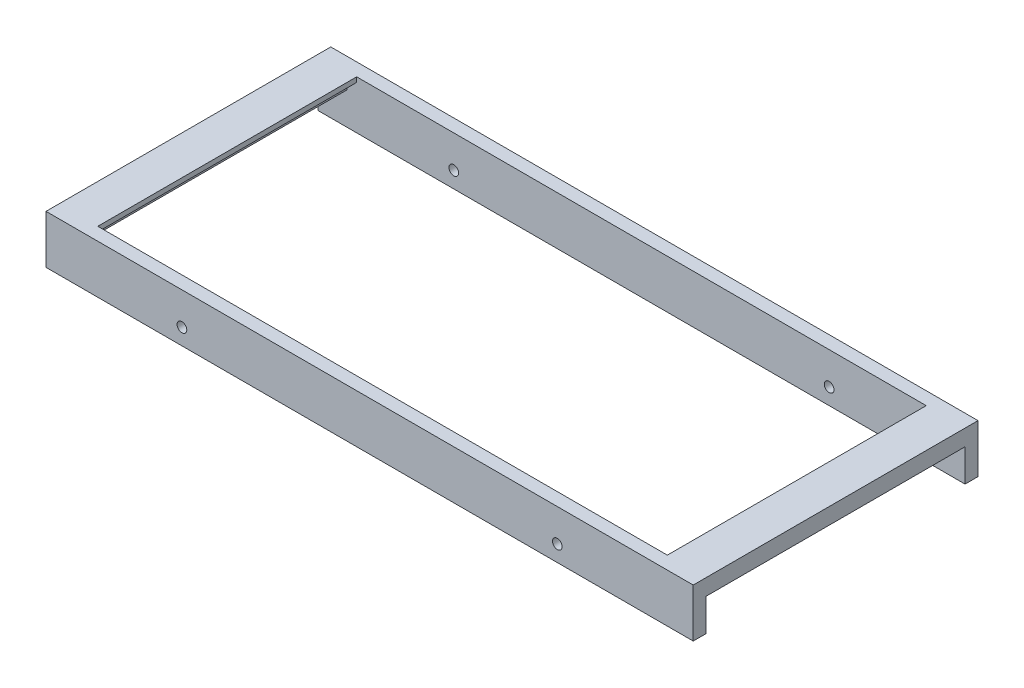
ISO-10303-21;
HEADER;
FILE_DESCRIPTION(('STEP AP214'),'2;1');
FILE_NAME('part.step','',(''),(''),'','','');
FILE_SCHEMA(('AUTOMOTIVE_DESIGN { 1 0 10303 214 1 1 1 1 }'));
ENDSEC;
DATA;
#1=APPLICATION_CONTEXT('core data for automotive mechanical design processes');
#2=APPLICATION_PROTOCOL_DEFINITION('international standard','automotive_design',2000,#1);
#3=PRODUCT_CONTEXT('',#1,'mechanical');
#4=PRODUCT('Part','Part','',(#3));
#5=PRODUCT_RELATED_PRODUCT_CATEGORY('part','',(#4));
#6=PRODUCT_DEFINITION_FORMATION('','',#4);
#7=PRODUCT_DEFINITION_CONTEXT('part definition',#1,'design');
#8=PRODUCT_DEFINITION('design','',#6,#7);
#9=PRODUCT_DEFINITION_SHAPE('','',#8);
#10=(LENGTH_UNIT() NAMED_UNIT(*) SI_UNIT(.MILLI.,.METRE.));
#11=(NAMED_UNIT(*) PLANE_ANGLE_UNIT() SI_UNIT($,.RADIAN.));
#12=(NAMED_UNIT(*) SI_UNIT($,.STERADIAN.) SOLID_ANGLE_UNIT());
#13=UNCERTAINTY_MEASURE_WITH_UNIT(LENGTH_MEASURE(1.E-05),#10,'distance_accuracy_value','');
#14=(GEOMETRIC_REPRESENTATION_CONTEXT(3) GLOBAL_UNCERTAINTY_ASSIGNED_CONTEXT((#13)) GLOBAL_UNIT_ASSIGNED_CONTEXT((#10,
#11,#12)) REPRESENTATION_CONTEXT('',''));
#15=CARTESIAN_POINT('',(0.,0.,0.));
#16=DIRECTION('',(0.,0.,1.));
#17=DIRECTION('',(1.,0.,0.));
#18=AXIS2_PLACEMENT_3D('',#15,#16,#17);
#19=CARTESIAN_POINT('',(191.,0.,4.));
#20=DIRECTION('',(-1.,0.,0.));
#21=DIRECTION('',(0.,0.,1.));
#22=AXIS2_PLACEMENT_3D('',#19,#20,#21);
#23=PLANE('',#22);
#24=DIRECTION('',(0.,0.,1.));
#25=VECTOR('',#24,1.);
#26=CARTESIAN_POINT('',(191.,32.,-80.));
#27=LINE('',#26,#25);
#28=CARTESIAN_POINT('',(191.,32.,-80.));
#29=VERTEX_POINT('',#28);
#30=CARTESIAN_POINT('',(191.,32.,0.));
#31=VERTEX_POINT('',#30);
#32=EDGE_CURVE('E256',#29,#31,#27,.T.);
#33=ORIENTED_EDGE('',*,*,#32,.F.);
#34=DIRECTION('',(0.,1.,0.));
#35=VECTOR('',#34,1.);
#36=CARTESIAN_POINT('',(191.,0.,-80.));
#37=LINE('',#36,#35);
#38=CARTESIAN_POINT('',(191.,28.5,-80.));
#39=VERTEX_POINT('',#38);
#40=EDGE_CURVE('E221',#39,#29,#37,.T.);
#41=ORIENTED_EDGE('',*,*,#40,.F.);
#42=DIRECTION('',(0.,0.,1.));
#43=VECTOR('',#42,1.);
#44=CARTESIAN_POINT('',(191.,28.5,-80.));
#45=LINE('',#44,#43);
#46=CARTESIAN_POINT('',(191.,28.5,0.));
#47=VERTEX_POINT('',#46);
#48=EDGE_CURVE('E259',#39,#47,#45,.T.);
#49=ORIENTED_EDGE('',*,*,#48,.T.);
#50=DIRECTION('',(0.,1.,0.));
#51=VECTOR('',#50,1.);
#52=CARTESIAN_POINT('',(191.,0.,0.));
#53=LINE('',#52,#51);
#54=EDGE_CURVE('E217',#47,#31,#53,.T.);
#55=ORIENTED_EDGE('',*,*,#54,.T.);
#56=EDGE_LOOP('',(#33,#41,#49,#55));
#57=FACE_BOUND('',#56,.T.);
#58=ADVANCED_FACE('F39',(#57),#23,.T.);
#59=CARTESIAN_POINT('',(9.,0.,4.));
#60=DIRECTION('',(-1.,0.,0.));
#61=DIRECTION('',(0.,0.,1.));
#62=AXIS2_PLACEMENT_3D('',#59,#60,#61);
#63=PLANE('',#62);
#64=DIRECTION('',(0.,1.,0.));
#65=VECTOR('',#64,1.);
#66=CARTESIAN_POINT('',(9.,0.,-80.));
#67=LINE('',#66,#65);
#68=CARTESIAN_POINT('',(9.,28.5,-80.));
#69=VERTEX_POINT('',#68);
#70=CARTESIAN_POINT('',(9.,32.,-80.));
#71=VERTEX_POINT('',#70);
#72=EDGE_CURVE('E304',#69,#71,#67,.T.);
#73=ORIENTED_EDGE('',*,*,#72,.T.);
#74=DIRECTION('',(0.,0.,1.));
#75=VECTOR('',#74,1.);
#76=CARTESIAN_POINT('',(9.,32.,-80.));
#77=LINE('',#76,#75);
#78=CARTESIAN_POINT('',(9.,32.,0.));
#79=VERTEX_POINT('',#78);
#80=EDGE_CURVE('E285',#71,#79,#77,.T.);
#81=ORIENTED_EDGE('',*,*,#80,.T.);
#82=DIRECTION('',(0.,1.,0.));
#83=VECTOR('',#82,1.);
#84=CARTESIAN_POINT('',(9.,0.,0.));
#85=LINE('',#84,#83);
#86=CARTESIAN_POINT('',(9.,28.5,0.));
#87=VERTEX_POINT('',#86);
#88=EDGE_CURVE('E232',#87,#79,#85,.T.);
#89=ORIENTED_EDGE('',*,*,#88,.F.);
#90=DIRECTION('',(0.,0.,1.));
#91=VECTOR('',#90,1.);
#92=CARTESIAN_POINT('',(9.,28.5,-80.));
#93=LINE('',#92,#91);
#94=EDGE_CURVE('E275',#69,#87,#93,.T.);
#95=ORIENTED_EDGE('',*,*,#94,.F.);
#96=EDGE_LOOP('',(#73,#81,#89,#95));
#97=FACE_BOUND('',#96,.T.);
#98=ADVANCED_FACE('F339',(#97),#63,.F.);
#99=CARTESIAN_POINT('',(0.,0.,0.));
#100=DIRECTION('',(0.,0.,1.));
#101=DIRECTION('',(1.,0.,0.));
#102=AXIS2_PLACEMENT_3D('',#99,#100,#101);
#103=PLANE('',#102);
#104=CARTESIAN_POINT('',(158.,23.5,0.));
#105=DIRECTION('',(0.,0.,1.));
#106=DIRECTION('',(1.,0.,0.));
#107=AXIS2_PLACEMENT_3D('',#104,#105,#106);
#108=CIRCLE('',#107,1.5);
#109=CARTESIAN_POINT('',(159.5,23.5,0.));
#110=VERTEX_POINT('',#109);
#111=EDGE_CURVE('E192',#110,#110,#108,.T.);
#112=ORIENTED_EDGE('',*,*,#111,.T.);
#113=EDGE_LOOP('',(#112));
#114=FACE_BOUND('',#113,.T.);
#115=CARTESIAN_POINT('',(42.,23.5,0.));
#116=DIRECTION('',(0.,0.,1.));
#117=DIRECTION('',(1.,0.,0.));
#118=AXIS2_PLACEMENT_3D('',#115,#116,#117);
#119=CIRCLE('',#118,1.5);
#120=CARTESIAN_POINT('',(43.5,23.5,0.));
#121=VERTEX_POINT('',#120);
#122=EDGE_CURVE('E189',#121,#121,#119,.F.);
#123=ORIENTED_EDGE('',*,*,#122,.F.);
#124=EDGE_LOOP('',(#123));
#125=FACE_BOUND('',#124,.T.);
#126=DIRECTION('',(0.,1.,0.));
#127=VECTOR('',#126,1.);
#128=CARTESIAN_POINT('',(200.,0.,0.));
#129=LINE('',#128,#127);
#130=CARTESIAN_POINT('',(200.,18.5,0.));
#131=VERTEX_POINT('',#130);
#132=CARTESIAN_POINT('',(200.,28.5,0.));
#133=VERTEX_POINT('',#132);
#134=EDGE_CURVE('E185',#131,#133,#129,.T.);
#135=ORIENTED_EDGE('',*,*,#134,.F.);
#136=DIRECTION('',(-1.,0.,0.));
#137=VECTOR('',#136,1.);
#138=CARTESIAN_POINT('',(0.,18.5,0.));
#139=LINE('',#138,#137);
#140=CARTESIAN_POINT('',(0.,18.5,0.));
#141=VERTEX_POINT('',#140);
#142=EDGE_CURVE('E302',#131,#141,#139,.T.);
#143=ORIENTED_EDGE('',*,*,#142,.T.);
#144=DIRECTION('',(0.,1.,0.));
#145=VECTOR('',#144,1.);
#146=CARTESIAN_POINT('',(0.,0.,0.));
#147=LINE('',#146,#145);
#148=CARTESIAN_POINT('',(0.,28.5,0.));
#149=VERTEX_POINT('',#148);
#150=EDGE_CURVE('E166',#141,#149,#147,.T.);
#151=ORIENTED_EDGE('',*,*,#150,.T.);
#152=DIRECTION('',(1.,0.,0.));
#153=VECTOR('',#152,1.);
#154=CARTESIAN_POINT('',(0.,28.5,0.));
#155=LINE('',#154,#153);
#156=EDGE_CURVE('E265',#149,#87,#155,.T.);
#157=ORIENTED_EDGE('',*,*,#156,.T.);
#158=ORIENTED_EDGE('',*,*,#88,.T.);
#159=DIRECTION('',(1.,0.,0.));
#160=VECTOR('',#159,1.);
#161=CARTESIAN_POINT('',(0.,32.,0.));
#162=LINE('',#161,#160);
#163=CARTESIAN_POINT('',(12.,32.,0.));
#164=VERTEX_POINT('',#163);
#165=EDGE_CURVE('E270',#79,#164,#162,.T.);
#166=ORIENTED_EDGE('',*,*,#165,.T.);
#167=DIRECTION('',(0.,-1.,0.));
#168=VECTOR('',#167,1.);
#169=CARTESIAN_POINT('',(12.,0.,0.));
#170=LINE('',#169,#168);
#171=CARTESIAN_POINT('',(12.,33.5,0.));
#172=VERTEX_POINT('',#171);
#173=EDGE_CURVE('E278',#172,#164,#170,.T.);
#174=ORIENTED_EDGE('',*,*,#173,.F.);
#175=DIRECTION('',(1.,0.,0.));
#176=VECTOR('',#175,1.);
#177=CARTESIAN_POINT('',(0.,33.5,0.));
#178=LINE('',#177,#176);
#179=CARTESIAN_POINT('',(188.,33.5,0.));
#180=VERTEX_POINT('',#179);
#181=EDGE_CURVE('E229',#172,#180,#178,.T.);
#182=ORIENTED_EDGE('',*,*,#181,.T.);
#183=DIRECTION('',(0.,-1.,0.));
#184=VECTOR('',#183,1.);
#185=CARTESIAN_POINT('',(188.,0.,0.));
#186=LINE('',#185,#184);
#187=CARTESIAN_POINT('',(188.,32.,0.));
#188=VERTEX_POINT('',#187);
#189=EDGE_CURVE('E240',#180,#188,#186,.T.);
#190=ORIENTED_EDGE('',*,*,#189,.T.);
#191=DIRECTION('',(-1.,0.,0.));
#192=VECTOR('',#191,1.);
#193=CARTESIAN_POINT('',(0.,32.,0.));
#194=LINE('',#193,#192);
#195=EDGE_CURVE('E247',#31,#188,#194,.T.);
#196=ORIENTED_EDGE('',*,*,#195,.F.);
#197=ORIENTED_EDGE('',*,*,#54,.F.);
#198=DIRECTION('',(-1.,0.,0.));
#199=VECTOR('',#198,1.);
#200=CARTESIAN_POINT('',(0.,28.5,0.));
#201=LINE('',#200,#199);
#202=EDGE_CURVE('E235',#133,#47,#201,.T.);
#203=ORIENTED_EDGE('',*,*,#202,.F.);
#204=EDGE_LOOP('',(#135,#143,#151,#157,#158,#166,#174,#182,#190,#196,#197,#203));
#205=FACE_BOUND('',#204,.T.);
#206=ADVANCED_FACE('F344',(#114,#125,#205),#103,.F.);
#207=CARTESIAN_POINT('',(200.,0.,4.));
#208=DIRECTION('',(-1.,0.,0.));
#209=DIRECTION('',(0.,0.,1.));
#210=AXIS2_PLACEMENT_3D('',#207,#208,#209);
#211=PLANE('',#210);
#212=DIRECTION('',(0.,1.,0.));
#213=VECTOR('',#212,1.);
#214=CARTESIAN_POINT('',(200.,0.,4.));
#215=LINE('',#214,#213);
#216=CARTESIAN_POINT('',(200.,18.5,4.));
#217=VERTEX_POINT('',#216);
#218=CARTESIAN_POINT('',(200.,33.5,4.));
#219=VERTEX_POINT('',#218);
#220=EDGE_CURVE('E179',#217,#219,#215,.T.);
#221=ORIENTED_EDGE('',*,*,#220,.F.);
#222=DIRECTION('',(0.,0.,-1.));
#223=VECTOR('',#222,1.);
#224=CARTESIAN_POINT('',(200.,18.5,4.));
#225=LINE('',#224,#223);
#226=EDGE_CURVE('E54',#217,#131,#225,.T.);
#227=ORIENTED_EDGE('',*,*,#226,.T.);
#228=ORIENTED_EDGE('',*,*,#134,.T.);
#229=DIRECTION('',(0.,0.,1.));
#230=VECTOR('',#229,1.);
#231=CARTESIAN_POINT('',(200.,28.5,-80.));
#232=LINE('',#231,#230);
#233=CARTESIAN_POINT('',(200.,28.5,-80.));
#234=VERTEX_POINT('',#233);
#235=EDGE_CURVE('E262',#234,#133,#232,.T.);
#236=ORIENTED_EDGE('',*,*,#235,.F.);
#237=DIRECTION('',(0.,1.,0.));
#238=VECTOR('',#237,1.);
#239=CARTESIAN_POINT('',(200.,0.,-80.));
#240=LINE('',#239,#238);
#241=CARTESIAN_POINT('',(200.,18.5,-80.));
#242=VERTEX_POINT('',#241);
#243=EDGE_CURVE('E220',#242,#234,#240,.T.);
#244=ORIENTED_EDGE('',*,*,#243,.F.);
#245=CARTESIAN_POINT('',(200.,18.5,-84.));
#246=VERTEX_POINT('',#245);
#247=EDGE_CURVE('E167',#242,#246,#225,.T.);
#248=ORIENTED_EDGE('',*,*,#247,.T.);
#249=DIRECTION('',(0.,1.,0.));
#250=VECTOR('',#249,1.);
#251=CARTESIAN_POINT('',(200.,0.,-84.));
#252=LINE('',#251,#250);
#253=CARTESIAN_POINT('',(200.,33.5,-84.));
#254=VERTEX_POINT('',#253);
#255=EDGE_CURVE('E204',#246,#254,#252,.T.);
#256=ORIENTED_EDGE('',*,*,#255,.T.);
#257=DIRECTION('',(0.,0.,-1.));
#258=VECTOR('',#257,1.);
#259=CARTESIAN_POINT('',(200.,33.5,4.));
#260=LINE('',#259,#258);
#261=EDGE_CURVE('E11',#219,#254,#260,.T.);
#262=ORIENTED_EDGE('',*,*,#261,.F.);
#263=EDGE_LOOP('',(#221,#227,#228,#236,#244,#248,#256,#262));
#264=FACE_BOUND('',#263,.T.);
#265=ADVANCED_FACE('F41',(#264),#211,.F.);
#266=CARTESIAN_POINT('',(0.,33.5,4.));
#267=DIRECTION('',(0.,1.,0.));
#268=DIRECTION('',(-1.,0.,0.));
#269=AXIS2_PLACEMENT_3D('',#266,#267,#268);
#270=PLANE('',#269);
#271=DIRECTION('',(1.,0.,0.));
#272=VECTOR('',#271,1.);
#273=CARTESIAN_POINT('',(0.,33.5,-80.));
#274=LINE('',#273,#272);
#275=CARTESIAN_POINT('',(12.,33.5,-80.));
#276=VERTEX_POINT('',#275);
#277=CARTESIAN_POINT('',(188.,33.5,-80.));
#278=VERTEX_POINT('',#277);
#279=EDGE_CURVE('E307',#276,#278,#274,.T.);
#280=ORIENTED_EDGE('',*,*,#279,.T.);
#281=DIRECTION('',(0.,0.,1.));
#282=VECTOR('',#281,1.);
#283=CARTESIAN_POINT('',(188.,33.5,-80.));
#284=LINE('',#283,#282);
#285=EDGE_CURVE('E245',#278,#180,#284,.T.);
#286=ORIENTED_EDGE('',*,*,#285,.T.);
#287=ORIENTED_EDGE('',*,*,#181,.F.);
#288=DIRECTION('',(0.,0.,1.));
#289=VECTOR('',#288,1.);
#290=CARTESIAN_POINT('',(12.,33.5,-80.));
#291=LINE('',#290,#289);
#292=EDGE_CURVE('E289',#276,#172,#291,.T.);
#293=ORIENTED_EDGE('',*,*,#292,.F.);
#294=EDGE_LOOP('',(#280,#286,#287,#293));
#295=FACE_BOUND('',#294,.T.);
#296=DIRECTION('',(0.,0.,-1.));
#297=VECTOR('',#296,1.);
#298=CARTESIAN_POINT('',(0.,33.5,4.));
#299=LINE('',#298,#297);
#300=CARTESIAN_POINT('',(0.,33.5,4.));
#301=VERTEX_POINT('',#300);
#302=CARTESIAN_POINT('',(0.,33.5,-84.));
#303=VERTEX_POINT('',#302);
#304=EDGE_CURVE('E47',#301,#303,#299,.T.);
#305=ORIENTED_EDGE('',*,*,#304,.F.);
#306=DIRECTION('',(1.,0.,0.));
#307=VECTOR('',#306,1.);
#308=CARTESIAN_POINT('',(0.,33.5,4.));
#309=LINE('',#308,#307);
#310=EDGE_CURVE('E172',#301,#219,#309,.T.);
#311=ORIENTED_EDGE('',*,*,#310,.T.);
#312=ORIENTED_EDGE('',*,*,#261,.T.);
#313=DIRECTION('',(1.,0.,0.));
#314=VECTOR('',#313,1.);
#315=CARTESIAN_POINT('',(0.,33.5,-84.));
#316=LINE('',#315,#314);
#317=EDGE_CURVE('E199',#303,#254,#316,.T.);
#318=ORIENTED_EDGE('',*,*,#317,.F.);
#319=EDGE_LOOP('',(#305,#311,#312,#318));
#320=FACE_BOUND('',#319,.T.);
#321=ADVANCED_FACE('F200',(#295,#320),#270,.T.);
#322=CARTESIAN_POINT('',(42.,23.5,4.));
#323=DIRECTION('',(0.,0.,-1.));
#324=DIRECTION('',(-1.,0.,0.));
#325=AXIS2_PLACEMENT_3D('',#322,#323,#324);
#326=CYLINDRICAL_SURFACE('',#325,1.5);
#327=CARTESIAN_POINT('',(42.,23.5,4.));
#328=DIRECTION('',(0.,0.,1.));
#329=DIRECTION('',(1.,0.,0.));
#330=AXIS2_PLACEMENT_3D('',#327,#328,#329);
#331=CIRCLE('',#330,1.5);
#332=CARTESIAN_POINT('',(43.5,23.5,4.));
#333=VERTEX_POINT('',#332);
#334=EDGE_CURVE('E174',#333,#333,#331,.F.);
#335=ORIENTED_EDGE('',*,*,#334,.F.);
#336=EDGE_LOOP('',(#335));
#337=FACE_BOUND('',#336,.T.);
#338=ORIENTED_EDGE('',*,*,#122,.T.);
#339=EDGE_LOOP('',(#338));
#340=FACE_BOUND('',#339,.T.);
#341=ADVANCED_FACE('F369',(#337,#340),#326,.F.);
#342=CARTESIAN_POINT('',(0.,0.,4.));
#343=DIRECTION('',(-1.,0.,0.));
#344=DIRECTION('',(0.,0.,1.));
#345=AXIS2_PLACEMENT_3D('',#342,#343,#344);
#346=PLANE('',#345);
#347=DIRECTION('',(0.,0.,-1.));
#348=VECTOR('',#347,1.);
#349=CARTESIAN_POINT('',(0.,18.5,4.));
#350=LINE('',#349,#348);
#351=CARTESIAN_POINT('',(0.,18.5,4.));
#352=VERTEX_POINT('',#351);
#353=EDGE_CURVE('E152',#352,#141,#350,.T.);
#354=ORIENTED_EDGE('',*,*,#353,.F.);
#355=DIRECTION('',(0.,1.,0.));
#356=VECTOR('',#355,1.);
#357=CARTESIAN_POINT('',(0.,0.,4.));
#358=LINE('',#357,#356);
#359=EDGE_CURVE('E163',#352,#301,#358,.T.);
#360=ORIENTED_EDGE('',*,*,#359,.T.);
#361=ORIENTED_EDGE('',*,*,#304,.T.);
#362=DIRECTION('',(0.,1.,0.));
#363=VECTOR('',#362,1.);
#364=CARTESIAN_POINT('',(0.,0.,-84.));
#365=LINE('',#364,#363);
#366=CARTESIAN_POINT('',(0.,18.5,-84.));
#367=VERTEX_POINT('',#366);
#368=EDGE_CURVE('E196',#367,#303,#365,.T.);
#369=ORIENTED_EDGE('',*,*,#368,.F.);
#370=CARTESIAN_POINT('',(0.,18.5,-80.));
#371=VERTEX_POINT('',#370);
#372=EDGE_CURVE('E62',#371,#367,#350,.T.);
#373=ORIENTED_EDGE('',*,*,#372,.F.);
#374=DIRECTION('',(0.,1.,0.));
#375=VECTOR('',#374,1.);
#376=CARTESIAN_POINT('',(0.,0.,-80.));
#377=LINE('',#376,#375);
#378=CARTESIAN_POINT('',(0.,28.5,-80.));
#379=VERTEX_POINT('',#378);
#380=EDGE_CURVE('E218',#371,#379,#377,.T.);
#381=ORIENTED_EDGE('',*,*,#380,.T.);
#382=DIRECTION('',(0.,0.,1.));
#383=VECTOR('',#382,1.);
#384=CARTESIAN_POINT('',(0.,28.5,-80.));
#385=LINE('',#384,#383);
#386=EDGE_CURVE('E187',#379,#149,#385,.T.);
#387=ORIENTED_EDGE('',*,*,#386,.T.);
#388=ORIENTED_EDGE('',*,*,#150,.F.);
#389=EDGE_LOOP('',(#354,#360,#361,#369,#373,#381,#387,#388));
#390=FACE_BOUND('',#389,.T.);
#391=ADVANCED_FACE('F161',(#390),#346,.T.);
#392=CARTESIAN_POINT('',(158.,23.5,4.));
#393=DIRECTION('',(0.,0.,-1.));
#394=DIRECTION('',(-1.,0.,0.));
#395=AXIS2_PLACEMENT_3D('',#392,#393,#394);
#396=CYLINDRICAL_SURFACE('',#395,1.5);
#397=CARTESIAN_POINT('',(158.,23.5,4.));
#398=DIRECTION('',(0.,0.,1.));
#399=DIRECTION('',(1.,0.,0.));
#400=AXIS2_PLACEMENT_3D('',#397,#398,#399);
#401=CIRCLE('',#400,1.5);
#402=CARTESIAN_POINT('',(159.5,23.5,4.));
#403=VERTEX_POINT('',#402);
#404=EDGE_CURVE('E177',#403,#403,#401,.T.);
#405=ORIENTED_EDGE('',*,*,#404,.T.);
#406=EDGE_LOOP('',(#405));
#407=FACE_BOUND('',#406,.T.);
#408=ORIENTED_EDGE('',*,*,#111,.F.);
#409=EDGE_LOOP('',(#408));
#410=FACE_BOUND('',#409,.T.);
#411=ADVANCED_FACE('F372',(#407,#410),#396,.F.);
#412=CARTESIAN_POINT('',(0.,0.,4.));
#413=DIRECTION('',(0.,0.,1.));
#414=DIRECTION('',(1.,0.,0.));
#415=AXIS2_PLACEMENT_3D('',#412,#413,#414);
#416=PLANE('',#415);
#417=DIRECTION('',(1.,0.,0.));
#418=VECTOR('',#417,1.);
#419=CARTESIAN_POINT('',(0.,18.5,4.));
#420=LINE('',#419,#418);
#421=EDGE_CURVE('E149',#352,#217,#420,.T.);
#422=ORIENTED_EDGE('',*,*,#421,.T.);
#423=ORIENTED_EDGE('',*,*,#220,.T.);
#424=ORIENTED_EDGE('',*,*,#310,.F.);
#425=ORIENTED_EDGE('',*,*,#359,.F.);
#426=EDGE_LOOP('',(#422,#423,#424,#425));
#427=FACE_BOUND('',#426,.T.);
#428=ORIENTED_EDGE('',*,*,#334,.T.);
#429=EDGE_LOOP('',(#428));
#430=FACE_BOUND('',#429,.T.);
#431=ORIENTED_EDGE('',*,*,#404,.F.);
#432=EDGE_LOOP('',(#431));
#433=FACE_BOUND('',#432,.T.);
#434=ADVANCED_FACE('F169',(#427,#430,#433),#416,.T.);
#435=CARTESIAN_POINT('',(0.,28.5,-80.));
#436=DIRECTION('',(0.,-1.,0.));
#437=DIRECTION('',(0.,0.,-1.));
#438=AXIS2_PLACEMENT_3D('',#435,#436,#437);
#439=PLANE('',#438);
#440=ORIENTED_EDGE('',*,*,#156,.F.);
#441=ORIENTED_EDGE('',*,*,#386,.F.);
#442=DIRECTION('',(1.,0.,0.));
#443=VECTOR('',#442,1.);
#444=CARTESIAN_POINT('',(0.,28.5,-80.));
#445=LINE('',#444,#443);
#446=EDGE_CURVE('E266',#379,#69,#445,.T.);
#447=ORIENTED_EDGE('',*,*,#446,.T.);
#448=ORIENTED_EDGE('',*,*,#94,.T.);
#449=EDGE_LOOP('',(#440,#441,#447,#448));
#450=FACE_BOUND('',#449,.T.);
#451=ADVANCED_FACE('F347',(#450),#439,.T.);
#452=CARTESIAN_POINT('',(12.,0.,-80.));
#453=DIRECTION('',(-1.,0.,0.));
#454=DIRECTION('',(0.,0.,1.));
#455=AXIS2_PLACEMENT_3D('',#452,#453,#454);
#456=PLANE('',#455);
#457=ORIENTED_EDGE('',*,*,#173,.T.);
#458=DIRECTION('',(0.,0.,1.));
#459=VECTOR('',#458,1.);
#460=CARTESIAN_POINT('',(12.,32.,-80.));
#461=LINE('',#460,#459);
#462=CARTESIAN_POINT('',(12.,32.,-80.));
#463=VERTEX_POINT('',#462);
#464=EDGE_CURVE('E287',#463,#164,#461,.T.);
#465=ORIENTED_EDGE('',*,*,#464,.F.);
#466=DIRECTION('',(0.,-1.,0.));
#467=VECTOR('',#466,1.);
#468=CARTESIAN_POINT('',(12.,0.,-80.));
#469=LINE('',#468,#467);
#470=EDGE_CURVE('E269',#276,#463,#469,.T.);
#471=ORIENTED_EDGE('',*,*,#470,.F.);
#472=ORIENTED_EDGE('',*,*,#292,.T.);
#473=EDGE_LOOP('',(#457,#465,#471,#472));
#474=FACE_BOUND('',#473,.T.);
#475=ADVANCED_FACE('F333',(#474),#456,.F.);
#476=CARTESIAN_POINT('',(0.,32.,-80.));
#477=DIRECTION('',(0.,-1.,0.));
#478=DIRECTION('',(0.,0.,-1.));
#479=AXIS2_PLACEMENT_3D('',#476,#477,#478);
#480=PLANE('',#479);
#481=ORIENTED_EDGE('',*,*,#165,.F.);
#482=ORIENTED_EDGE('',*,*,#80,.F.);
#483=DIRECTION('',(1.,0.,0.));
#484=VECTOR('',#483,1.);
#485=CARTESIAN_POINT('',(0.,32.,-80.));
#486=LINE('',#485,#484);
#487=EDGE_CURVE('E272',#71,#463,#486,.T.);
#488=ORIENTED_EDGE('',*,*,#487,.T.);
#489=ORIENTED_EDGE('',*,*,#464,.T.);
#490=EDGE_LOOP('',(#481,#482,#488,#489));
#491=FACE_BOUND('',#490,.T.);
#492=ADVANCED_FACE('F341',(#491),#480,.T.);
#493=CARTESIAN_POINT('',(0.,28.5,-80.));
#494=DIRECTION('',(0.,1.,0.));
#495=DIRECTION('',(0.,0.,1.));
#496=AXIS2_PLACEMENT_3D('',#493,#494,#495);
#497=PLANE('',#496);
#498=ORIENTED_EDGE('',*,*,#202,.T.);
#499=ORIENTED_EDGE('',*,*,#48,.F.);
#500=DIRECTION('',(-1.,0.,0.));
#501=VECTOR('',#500,1.);
#502=CARTESIAN_POINT('',(0.,28.5,-80.));
#503=LINE('',#502,#501);
#504=EDGE_CURVE('E236',#234,#39,#503,.T.);
#505=ORIENTED_EDGE('',*,*,#504,.F.);
#506=ORIENTED_EDGE('',*,*,#235,.T.);
#507=EDGE_LOOP('',(#498,#499,#505,#506));
#508=FACE_BOUND('',#507,.T.);
#509=ADVANCED_FACE('F352',(#508),#497,.F.);
#510=CARTESIAN_POINT('',(0.,32.,-80.));
#511=DIRECTION('',(0.,1.,0.));
#512=DIRECTION('',(0.,0.,1.));
#513=AXIS2_PLACEMENT_3D('',#510,#511,#512);
#514=PLANE('',#513);
#515=ORIENTED_EDGE('',*,*,#195,.T.);
#516=DIRECTION('',(0.,0.,1.));
#517=VECTOR('',#516,1.);
#518=CARTESIAN_POINT('',(188.,32.,-80.));
#519=LINE('',#518,#517);
#520=CARTESIAN_POINT('',(188.,32.,-80.));
#521=VERTEX_POINT('',#520);
#522=EDGE_CURVE('E254',#521,#188,#519,.T.);
#523=ORIENTED_EDGE('',*,*,#522,.F.);
#524=DIRECTION('',(-1.,0.,0.));
#525=VECTOR('',#524,1.);
#526=CARTESIAN_POINT('',(0.,32.,-80.));
#527=LINE('',#526,#525);
#528=EDGE_CURVE('E239',#29,#521,#527,.T.);
#529=ORIENTED_EDGE('',*,*,#528,.F.);
#530=ORIENTED_EDGE('',*,*,#32,.T.);
#531=EDGE_LOOP('',(#515,#523,#529,#530));
#532=FACE_BOUND('',#531,.T.);
#533=ADVANCED_FACE('F322',(#532),#514,.F.);
#534=CARTESIAN_POINT('',(188.,0.,-80.));
#535=DIRECTION('',(-1.,0.,0.));
#536=DIRECTION('',(0.,0.,1.));
#537=AXIS2_PLACEMENT_3D('',#534,#535,#536);
#538=PLANE('',#537);
#539=ORIENTED_EDGE('',*,*,#189,.F.);
#540=ORIENTED_EDGE('',*,*,#285,.F.);
#541=DIRECTION('',(0.,-1.,0.));
#542=VECTOR('',#541,1.);
#543=CARTESIAN_POINT('',(188.,0.,-80.));
#544=LINE('',#543,#542);
#545=EDGE_CURVE('E242',#278,#521,#544,.T.);
#546=ORIENTED_EDGE('',*,*,#545,.T.);
#547=ORIENTED_EDGE('',*,*,#522,.T.);
#548=EDGE_LOOP('',(#539,#540,#546,#547));
#549=FACE_BOUND('',#548,.T.);
#550=ADVANCED_FACE('F325',(#549),#538,.T.);
#551=CARTESIAN_POINT('',(0.,0.,-80.));
#552=DIRECTION('',(0.,0.,-1.));
#553=DIRECTION('',(1.,0.,0.));
#554=AXIS2_PLACEMENT_3D('',#551,#552,#553);
#555=PLANE('',#554);
#556=ORIENTED_EDGE('',*,*,#380,.F.);
#557=DIRECTION('',(1.,0.,0.));
#558=VECTOR('',#557,1.);
#559=CARTESIAN_POINT('',(0.,18.5,-80.));
#560=LINE('',#559,#558);
#561=EDGE_CURVE('E298',#371,#242,#560,.T.);
#562=ORIENTED_EDGE('',*,*,#561,.T.);
#563=ORIENTED_EDGE('',*,*,#243,.T.);
#564=ORIENTED_EDGE('',*,*,#504,.T.);
#565=ORIENTED_EDGE('',*,*,#40,.T.);
#566=ORIENTED_EDGE('',*,*,#528,.T.);
#567=ORIENTED_EDGE('',*,*,#545,.F.);
#568=ORIENTED_EDGE('',*,*,#279,.F.);
#569=ORIENTED_EDGE('',*,*,#470,.T.);
#570=ORIENTED_EDGE('',*,*,#487,.F.);
#571=ORIENTED_EDGE('',*,*,#72,.F.);
#572=ORIENTED_EDGE('',*,*,#446,.F.);
#573=EDGE_LOOP('',(#556,#562,#563,#564,#565,#566,#567,#568,#569,#570,#571,#572));
#574=FACE_BOUND('',#573,.T.);
#575=CARTESIAN_POINT('',(42.,23.5,-80.));
#576=DIRECTION('',(0.,0.,1.));
#577=DIRECTION('',(1.,0.,0.));
#578=AXIS2_PLACEMENT_3D('',#575,#576,#577);
#579=CIRCLE('',#578,1.5);
#580=CARTESIAN_POINT('',(43.5,23.5,-80.));
#581=VERTEX_POINT('',#580);
#582=EDGE_CURVE('E223',#581,#581,#579,.F.);
#583=ORIENTED_EDGE('',*,*,#582,.T.);
#584=EDGE_LOOP('',(#583));
#585=FACE_BOUND('',#584,.T.);
#586=CARTESIAN_POINT('',(158.,23.5,-80.));
#587=DIRECTION('',(0.,0.,1.));
#588=DIRECTION('',(1.,0.,0.));
#589=AXIS2_PLACEMENT_3D('',#586,#587,#588);
#590=CIRCLE('',#589,1.5);
#591=CARTESIAN_POINT('',(159.5,23.5,-80.));
#592=VERTEX_POINT('',#591);
#593=EDGE_CURVE('E208',#592,#592,#590,.T.);
#594=ORIENTED_EDGE('',*,*,#593,.F.);
#595=EDGE_LOOP('',(#594));
#596=FACE_BOUND('',#595,.T.);
#597=ADVANCED_FACE('F312',(#574,#585,#596),#555,.F.);
#598=CARTESIAN_POINT('',(42.,23.5,-84.));
#599=DIRECTION('',(0.,0.,1.));
#600=DIRECTION('',(1.,0.,0.));
#601=AXIS2_PLACEMENT_3D('',#598,#599,#600);
#602=CYLINDRICAL_SURFACE('',#601,1.5);
#603=CARTESIAN_POINT('',(42.,23.5,-84.));
#604=DIRECTION('',(0.,0.,1.));
#605=DIRECTION('',(1.,0.,0.));
#606=AXIS2_PLACEMENT_3D('',#603,#604,#605);
#607=CIRCLE('',#606,1.5);
#608=CARTESIAN_POINT('',(43.5,23.5,-84.));
#609=VERTEX_POINT('',#608);
#610=EDGE_CURVE('E206',#609,#609,#607,.F.);
#611=ORIENTED_EDGE('',*,*,#610,.T.);
#612=EDGE_LOOP('',(#611));
#613=FACE_BOUND('',#612,.T.);
#614=ORIENTED_EDGE('',*,*,#582,.F.);
#615=EDGE_LOOP('',(#614));
#616=FACE_BOUND('',#615,.T.);
#617=ADVANCED_FACE('F424',(#613,#616),#602,.F.);
#618=CARTESIAN_POINT('',(158.,23.5,-84.));
#619=DIRECTION('',(0.,0.,1.));
#620=DIRECTION('',(1.,0.,0.));
#621=AXIS2_PLACEMENT_3D('',#618,#619,#620);
#622=CYLINDRICAL_SURFACE('',#621,1.5);
#623=CARTESIAN_POINT('',(158.,23.5,-84.));
#624=DIRECTION('',(0.,0.,1.));
#625=DIRECTION('',(1.,0.,0.));
#626=AXIS2_PLACEMENT_3D('',#623,#624,#625);
#627=CIRCLE('',#626,1.5);
#628=CARTESIAN_POINT('',(159.5,23.5,-84.));
#629=VERTEX_POINT('',#628);
#630=EDGE_CURVE('E214',#629,#629,#627,.T.);
#631=ORIENTED_EDGE('',*,*,#630,.F.);
#632=EDGE_LOOP('',(#631));
#633=FACE_BOUND('',#632,.T.);
#634=ORIENTED_EDGE('',*,*,#593,.T.);
#635=EDGE_LOOP('',(#634));
#636=FACE_BOUND('',#635,.T.);
#637=ADVANCED_FACE('F429',(#633,#636),#622,.F.);
#638=CARTESIAN_POINT('',(0.,0.,-84.));
#639=DIRECTION('',(0.,0.,-1.));
#640=DIRECTION('',(1.,0.,0.));
#641=AXIS2_PLACEMENT_3D('',#638,#639,#640);
#642=PLANE('',#641);
#643=DIRECTION('',(1.,0.,0.));
#644=VECTOR('',#643,1.);
#645=CARTESIAN_POINT('',(0.,18.5,-84.));
#646=LINE('',#645,#644);
#647=EDGE_CURVE('E157',#367,#246,#646,.T.);
#648=ORIENTED_EDGE('',*,*,#647,.F.);
#649=ORIENTED_EDGE('',*,*,#368,.T.);
#650=ORIENTED_EDGE('',*,*,#317,.T.);
#651=ORIENTED_EDGE('',*,*,#255,.F.);
#652=EDGE_LOOP('',(#648,#649,#650,#651));
#653=FACE_BOUND('',#652,.T.);
#654=ORIENTED_EDGE('',*,*,#610,.F.);
#655=EDGE_LOOP('',(#654));
#656=FACE_BOUND('',#655,.T.);
#657=ORIENTED_EDGE('',*,*,#630,.T.);
#658=EDGE_LOOP('',(#657));
#659=FACE_BOUND('',#658,.T.);
#660=ADVANCED_FACE('F294',(#653,#656,#659),#642,.T.);
#661=CARTESIAN_POINT('',(0.,18.5,4.));
#662=DIRECTION('',(0.,1.,0.));
#663=DIRECTION('',(-1.,0.,0.));
#664=AXIS2_PLACEMENT_3D('',#661,#662,#663);
#665=PLANE('',#664);
#666=ORIENTED_EDGE('',*,*,#372,.T.);
#667=ORIENTED_EDGE('',*,*,#647,.T.);
#668=ORIENTED_EDGE('',*,*,#247,.F.);
#669=ORIENTED_EDGE('',*,*,#561,.F.);
#670=EDGE_LOOP('',(#666,#667,#668,#669));
#671=FACE_BOUND('',#670,.T.);
#672=ADVANCED_FACE('F493',(#671),#665,.F.);
#673=ORIENTED_EDGE('',*,*,#226,.F.);
#674=ORIENTED_EDGE('',*,*,#421,.F.);
#675=ORIENTED_EDGE('',*,*,#353,.T.);
#676=ORIENTED_EDGE('',*,*,#142,.F.);
#677=EDGE_LOOP('',(#673,#674,#675,#676));
#678=FACE_BOUND('',#677,.T.);
#679=ADVANCED_FACE('F151',(#678),#665,.F.);
#680=CLOSED_SHELL('',(#58,#98,#206,#265,#321,#341,#391,#411,#434,#451,#475,#492,#509,#533,#550,
#597,#617,#637,#660,#672,#679));
#681=MANIFOLD_SOLID_BREP('B2',#680);
#682=ADVANCED_BREP_SHAPE_REPRESENTATION('',(#18,#681),#14);
#683=SHAPE_DEFINITION_REPRESENTATION(#9,#682);
ENDSEC;
END-ISO-10303-21;
